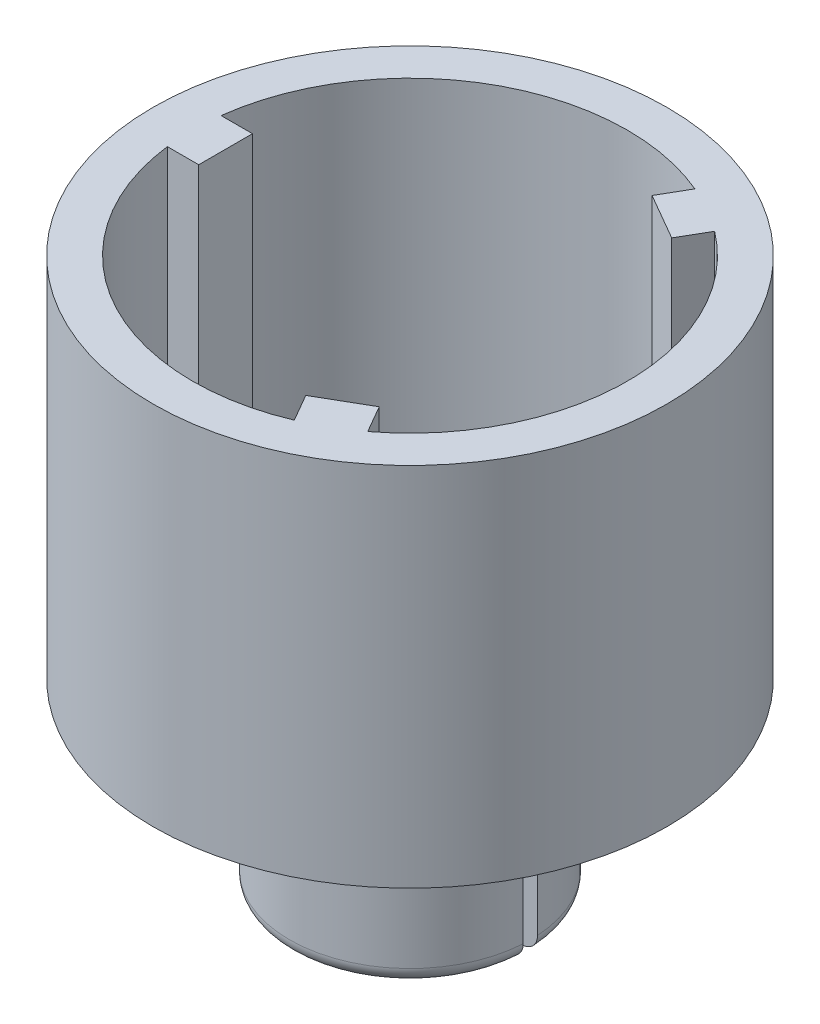
ISO-10303-21;
HEADER;
FILE_DESCRIPTION(('STEP AP214'),'2;1');
FILE_NAME('part.step','',(''),(''),'','','');
FILE_SCHEMA(('AUTOMOTIVE_DESIGN { 1 0 10303 214 1 1 1 1 }'));
ENDSEC;
DATA;
#1=APPLICATION_CONTEXT('core data for automotive mechanical design processes');
#2=APPLICATION_PROTOCOL_DEFINITION('international standard','automotive_design',2000,#1);
#3=PRODUCT_CONTEXT('',#1,'mechanical');
#4=PRODUCT('Part','Part','',(#3));
#5=PRODUCT_RELATED_PRODUCT_CATEGORY('part','',(#4));
#6=PRODUCT_DEFINITION_FORMATION('','',#4);
#7=PRODUCT_DEFINITION_CONTEXT('part definition',#1,'design');
#8=PRODUCT_DEFINITION('design','',#6,#7);
#9=PRODUCT_DEFINITION_SHAPE('','',#8);
#10=(LENGTH_UNIT() NAMED_UNIT(*) SI_UNIT(.MILLI.,.METRE.));
#11=(NAMED_UNIT(*) PLANE_ANGLE_UNIT() SI_UNIT($,.RADIAN.));
#12=(NAMED_UNIT(*) SI_UNIT($,.STERADIAN.) SOLID_ANGLE_UNIT());
#13=UNCERTAINTY_MEASURE_WITH_UNIT(LENGTH_MEASURE(1.E-05),#10,'distance_accuracy_value','');
#14=(GEOMETRIC_REPRESENTATION_CONTEXT(3) GLOBAL_UNCERTAINTY_ASSIGNED_CONTEXT((#13)) GLOBAL_UNIT_ASSIGNED_CONTEXT((#10,
#11,#12)) REPRESENTATION_CONTEXT('',''));
#15=CARTESIAN_POINT('',(0.,0.,0.));
#16=DIRECTION('',(0.,0.,1.));
#17=DIRECTION('',(1.,0.,0.));
#18=AXIS2_PLACEMENT_3D('',#15,#16,#17);
#19=CARTESIAN_POINT('',(0.,6.29999999999999,0.));
#20=DIRECTION('',(0.,1.,0.));
#21=DIRECTION('',(0.,0.,1.));
#22=AXIS2_PLACEMENT_3D('',#19,#20,#21);
#23=CYLINDRICAL_SURFACE('',#22,27.5);
#24=CARTESIAN_POINT('',(0.,46.3,0.));
#25=DIRECTION('',(0.,1.,0.));
#26=DIRECTION('',(0.,0.,1.));
#27=AXIS2_PLACEMENT_3D('',#24,#25,#26);
#28=CIRCLE('',#27,27.5);
#29=CARTESIAN_POINT('',(16.5889907610815,46.3,21.9329748444836));
#30=VERTEX_POINT('',#29);
#31=CARTESIAN_POINT('',(16.5889907610812,46.3,-21.9329748444839));
#32=VERTEX_POINT('',#31);
#33=EDGE_CURVE('E57',#30,#32,#28,.T.);
#34=ORIENTED_EDGE('',*,*,#33,.T.);
#35=DIRECTION('',(0.,1.,0.));
#36=VECTOR('',#35,1.);
#37=CARTESIAN_POINT('',(16.5889907610812,6.29999999999999,-21.9329748444839));
#38=LINE('',#37,#36);
#39=CARTESIAN_POINT('',(16.5889907610812,6.29999999999999,-21.9329748444839));
#40=VERTEX_POINT('',#39);
#41=EDGE_CURVE('E215',#32,#40,#38,.F.);
#42=ORIENTED_EDGE('',*,*,#41,.T.);
#43=CARTESIAN_POINT('',(0.,6.29999999999999,0.));
#44=DIRECTION('',(0.,1.,0.));
#45=DIRECTION('',(0.,0.,1.));
#46=AXIS2_PLACEMENT_3D('',#43,#44,#45);
#47=CIRCLE('',#46,27.5);
#48=CARTESIAN_POINT('',(16.5889907610815,6.29999999999999,21.9329748444836));
#49=VERTEX_POINT('',#48);
#50=EDGE_CURVE('E307',#49,#40,#47,.T.);
#51=ORIENTED_EDGE('',*,*,#50,.F.);
#52=DIRECTION('',(0.,1.,0.));
#53=VECTOR('',#52,1.);
#54=CARTESIAN_POINT('',(16.5889907610815,6.29999999999999,21.9329748444836));
#55=LINE('',#54,#53);
#56=EDGE_CURVE('E234',#49,#30,#55,.T.);
#57=ORIENTED_EDGE('',*,*,#56,.T.);
#58=EDGE_LOOP('',(#34,#42,#51,#57));
#59=FACE_BOUND('',#58,.T.);
#60=ADVANCED_FACE('F33',(#59),#23,.F.);
#61=CARTESIAN_POINT('',(-27.2890087764287,46.3,3.4));
#62=VERTEX_POINT('',#61);
#63=CARTESIAN_POINT('',(10.7000180153474,46.3,25.3329748444837));
#64=VERTEX_POINT('',#63);
#65=EDGE_CURVE('E309',#62,#64,#28,.T.);
#66=ORIENTED_EDGE('',*,*,#65,.T.);
#67=DIRECTION('',(0.,1.,0.));
#68=VECTOR('',#67,1.);
#69=CARTESIAN_POINT('',(10.7000180153474,6.29999999999999,25.3329748444837));
#70=LINE('',#69,#68);
#71=CARTESIAN_POINT('',(10.7000180153474,6.29999999999999,25.3329748444837));
#72=VERTEX_POINT('',#71);
#73=EDGE_CURVE('E236',#64,#72,#70,.F.);
#74=ORIENTED_EDGE('',*,*,#73,.T.);
#75=CARTESIAN_POINT('',(-27.2890087764287,6.29999999999999,3.4));
#76=VERTEX_POINT('',#75);
#77=EDGE_CURVE('E303',#76,#72,#47,.T.);
#78=ORIENTED_EDGE('',*,*,#77,.F.);
#79=DIRECTION('',(0.,1.,0.));
#80=VECTOR('',#79,1.);
#81=CARTESIAN_POINT('',(-27.2890087764287,6.29999999999999,3.4));
#82=LINE('',#81,#80);
#83=EDGE_CURVE('E270',#76,#62,#82,.T.);
#84=ORIENTED_EDGE('',*,*,#83,.T.);
#85=EDGE_LOOP('',(#66,#74,#78,#84));
#86=FACE_BOUND('',#85,.T.);
#87=ADVANCED_FACE('F431',(#86),#23,.F.);
#88=CARTESIAN_POINT('',(33.0968426441505,59.2183375863677,0.903363251346434));
#89=DIRECTION('',(0.,0.,1.));
#90=DIRECTION('',(1.,0.,0.));
#91=AXIS2_PLACEMENT_3D('',#88,#89,#90);
#92=PLANE('',#91);
#93=DIRECTION('',(-1.,0.,0.));
#94=VECTOR('',#93,1.);
#95=CARTESIAN_POINT('',(0.,-23.,0.903363251346434));
#96=LINE('',#95,#94);
#97=CARTESIAN_POINT('',(13.2191692188321,-23.,0.903363251346434));
#98=VERTEX_POINT('',#97);
#99=CARTESIAN_POINT('',(7.44539688909307,-23.,0.903363251346434));
#100=VERTEX_POINT('',#99);
#101=EDGE_CURVE('E326',#98,#100,#96,.T.);
#102=ORIENTED_EDGE('',*,*,#101,.T.);
#103=DIRECTION('',(0.,1.,0.));
#104=VECTOR('',#103,1.);
#105=CARTESIAN_POINT('',(7.44539688909307,-23.1133466704744,0.903363251346434));
#106=LINE('',#105,#104);
#107=CARTESIAN_POINT('',(7.44539688909307,-7.,0.903363251346434));
#108=VERTEX_POINT('',#107);
#109=EDGE_CURVE('E245',#100,#108,#106,.T.);
#110=ORIENTED_EDGE('',*,*,#109,.T.);
#111=DIRECTION('',(1.,0.,0.));
#112=VECTOR('',#111,1.);
#113=CARTESIAN_POINT('',(33.0968426441505,-7.,0.903363251346434));
#114=LINE('',#113,#112);
#115=CARTESIAN_POINT('',(15.2232202518428,-7.,0.903363251346434));
#116=VERTEX_POINT('',#115);
#117=EDGE_CURVE('E275',#108,#116,#114,.T.);
#118=ORIENTED_EDGE('',*,*,#117,.T.);
#119=DIRECTION('',(0.,1.,0.));
#120=VECTOR('',#119,1.);
#121=CARTESIAN_POINT('',(15.2232202518428,-23.,0.903363251346434));
#122=LINE('',#121,#120);
#123=CARTESIAN_POINT('',(15.2232202518428,-21.,0.903363251346434));
#124=VERTEX_POINT('',#123);
#125=EDGE_CURVE('E292',#124,#116,#122,.T.);
#126=ORIENTED_EDGE('',*,*,#125,.F.);
#127=CARTESIAN_POINT('',(15.2232202518428,-21.,0.903363251346434));
#128=CARTESIAN_POINT('',(15.2232199232489,-21.0561948021802,0.903363251346434));
#129=CARTESIAN_POINT('',(15.2208462010748,-21.1123626608613,0.903363251346434));
#130=CARTESIAN_POINT('',(15.211376767415,-21.2242959584954,0.903363251346434));
#131=CARTESIAN_POINT('',(15.2042812970132,-21.2800614178472,0.903363251346434));
#132=CARTESIAN_POINT('',(15.1759810982783,-21.4460523458939,0.903363251346434));
#133=CARTESIAN_POINT('',(15.1477623870815,-21.5551651452531,0.903363251346434));
#134=CARTESIAN_POINT('',(15.0734106566527,-21.7671001409726,0.903363251346434));
#135=CARTESIAN_POINT('',(15.0272693095068,-21.8699193872293,0.903363251346434));
#136=CARTESIAN_POINT('',(14.9183959883233,-22.0663574694,0.903363251346434));
#137=CARTESIAN_POINT('',(14.8556667286063,-22.1599778071192,0.903363251346434));
#138=CARTESIAN_POINT('',(14.7153560416617,-22.3354365581613,0.903363251346434));
#139=CARTESIAN_POINT('',(14.6377642041245,-22.4172666423318,0.903363251346434));
#140=CARTESIAN_POINT('',(14.469946451435,-22.5667823902729,0.903363251346434));
#141=CARTESIAN_POINT('',(14.3797180536156,-22.6344652680558,0.903363251346434));
#142=CARTESIAN_POINT('',(14.1890336936746,-22.7538779272838,0.903363251346434));
#143=CARTESIAN_POINT('',(14.0885588357039,-22.8055774991095,0.903363251346434));
#144=CARTESIAN_POINT('',(13.8803857068313,-22.8913863101094,0.903363251346434));
#145=CARTESIAN_POINT('',(13.7726914572009,-22.925505251361,0.903363251346434));
#146=CARTESIAN_POINT('',(13.5901629405491,-22.9668623444403,0.903363251346434));
#147=CARTESIAN_POINT('',(13.5164605185664,-22.9792819990314,0.903363251346434));
#148=CARTESIAN_POINT('',(13.368238510768,-22.9958498253569,0.903363251346434));
#149=CARTESIAN_POINT('',(13.2937202413688,-23.0000097771421,0.903363251346434));
#150=CARTESIAN_POINT('',(13.2191692188321,-23.,0.903363251346434));
#151=B_SPLINE_CURVE_WITH_KNOTS('',3,(#127,#128,#129,#130,#131,#132,#133,#134,#135,#136,#137,
#138,#139,#140,#141,#142,#143,#144,#145,#146,#147,#148,#149,#150),.UNSPECIFIED.,.F.,.F.,(4,2,2,
2,2,2,2,2,2,2,2,4),(0.,0.168480781633668,0.336952961602159,0.673326346007657,1.00985621666657,
1.34633105416501,1.68304243888204,2.01982006931767,2.35723039660949,2.69445432008634,
2.91824695183647,3.14172017891371),.UNSPECIFIED.);
#152=EDGE_CURVE('E332',#124,#98,#151,.T.);
#153=ORIENTED_EDGE('',*,*,#152,.T.);
#154=EDGE_LOOP('',(#102,#110,#118,#126,#153));
#155=FACE_BOUND('',#154,.T.);
#156=ADVANCED_FACE('F356',(#155),#92,.F.);
#157=CARTESIAN_POINT('',(33.0968426441505,59.2183375863677,-0.903363251346434));
#158=DIRECTION('',(0.,0.,-1.));
#159=DIRECTION('',(-1.,0.,0.));
#160=AXIS2_PLACEMENT_3D('',#157,#158,#159);
#161=PLANE('',#160);
#162=DIRECTION('',(1.,0.,0.));
#163=VECTOR('',#162,1.);
#164=CARTESIAN_POINT('',(0.,-23.,-0.903363251346434));
#165=LINE('',#164,#163);
#166=CARTESIAN_POINT('',(-13.2191692188321,-23.,-0.903363251346434));
#167=VERTEX_POINT('',#166);
#168=CARTESIAN_POINT('',(-7.44539688909307,-23.,-0.903363251346434));
#169=VERTEX_POINT('',#168);
#170=EDGE_CURVE('E322',#167,#169,#165,.T.);
#171=ORIENTED_EDGE('',*,*,#170,.T.);
#172=DIRECTION('',(0.,1.,0.));
#173=VECTOR('',#172,1.);
#174=CARTESIAN_POINT('',(-7.44539688909307,-23.1133466704744,-0.903363251346434));
#175=LINE('',#174,#173);
#176=CARTESIAN_POINT('',(-7.44539688909307,-7.,-0.903363251346434));
#177=VERTEX_POINT('',#176);
#178=EDGE_CURVE('E390',#169,#177,#175,.T.);
#179=ORIENTED_EDGE('',*,*,#178,.T.);
#180=DIRECTION('',(-1.,0.,0.));
#181=VECTOR('',#180,1.);
#182=CARTESIAN_POINT('',(33.0968426441505,-7.,-0.903363251346434));
#183=LINE('',#182,#181);
#184=CARTESIAN_POINT('',(-15.2232202518428,-7.,-0.903363251346434));
#185=VERTEX_POINT('',#184);
#186=EDGE_CURVE('E279',#177,#185,#183,.T.);
#187=ORIENTED_EDGE('',*,*,#186,.T.);
#188=DIRECTION('',(0.,1.,0.));
#189=VECTOR('',#188,1.);
#190=CARTESIAN_POINT('',(-15.2232202518428,-23.,-0.903363251346434));
#191=LINE('',#190,#189);
#192=CARTESIAN_POINT('',(-15.2232202518428,-21.,-0.903363251346434));
#193=VERTEX_POINT('',#192);
#194=EDGE_CURVE('E286',#193,#185,#191,.T.);
#195=ORIENTED_EDGE('',*,*,#194,.F.);
#196=CARTESIAN_POINT('',(-15.2232202518428,-21.,-0.903363251346434));
#197=CARTESIAN_POINT('',(-15.2232199232489,-21.0561948021802,-0.903363251346434));
#198=CARTESIAN_POINT('',(-15.2208462010748,-21.1123626608613,-0.903363251346434));
#199=CARTESIAN_POINT('',(-15.211376767415,-21.2242959584954,-0.903363251346434));
#200=CARTESIAN_POINT('',(-15.2042812970132,-21.2800614178472,-0.903363251346434));
#201=CARTESIAN_POINT('',(-15.1759810982783,-21.4460523458939,-0.903363251346434));
#202=CARTESIAN_POINT('',(-15.1477623870815,-21.5551651452531,-0.903363251346434));
#203=CARTESIAN_POINT('',(-15.0734106566527,-21.7671001409726,-0.903363251346434));
#204=CARTESIAN_POINT('',(-15.0272693095068,-21.8699193872293,-0.903363251346434));
#205=CARTESIAN_POINT('',(-14.9183959883233,-22.0663574694,-0.903363251346434));
#206=CARTESIAN_POINT('',(-14.8556667286063,-22.1599778071192,-0.903363251346434));
#207=CARTESIAN_POINT('',(-14.7153560416617,-22.3354365581613,-0.903363251346434));
#208=CARTESIAN_POINT('',(-14.6377642041245,-22.4172666423318,-0.903363251346434));
#209=CARTESIAN_POINT('',(-14.469946451435,-22.5667823902729,-0.903363251346434));
#210=CARTESIAN_POINT('',(-14.3797180536156,-22.6344652680558,-0.903363251346434));
#211=CARTESIAN_POINT('',(-14.1890336936746,-22.7538779272838,-0.903363251346434));
#212=CARTESIAN_POINT('',(-14.0885588357039,-22.8055774991095,-0.903363251346434));
#213=CARTESIAN_POINT('',(-13.8803857068313,-22.8913863101094,-0.903363251346434));
#214=CARTESIAN_POINT('',(-13.7726914572009,-22.925505251361,-0.903363251346434));
#215=CARTESIAN_POINT('',(-13.5901629405491,-22.9668623444403,-0.903363251346434));
#216=CARTESIAN_POINT('',(-13.5164605185664,-22.9792819990314,-0.903363251346434));
#217=CARTESIAN_POINT('',(-13.368238510768,-22.9958498253569,-0.903363251346434));
#218=CARTESIAN_POINT('',(-13.2937202413688,-23.0000097771421,-0.903363251346434));
#219=CARTESIAN_POINT('',(-13.2191692188321,-23.,-0.903363251346434));
#220=B_SPLINE_CURVE_WITH_KNOTS('',3,(#196,#197,#198,#199,#200,#201,#202,#203,#204,#205,#206,
#207,#208,#209,#210,#211,#212,#213,#214,#215,#216,#217,#218,#219),.UNSPECIFIED.,.F.,.F.,(4,2,2,
2,2,2,2,2,2,2,2,4),(0.,0.168480781633668,0.336952961602159,0.673326346007657,1.00985621666657,
1.34633105416501,1.68304243888204,2.01982006931767,2.35723039660949,2.69445432008634,
2.91824695183647,3.14172017891371),.UNSPECIFIED.);
#221=EDGE_CURVE('E369',#193,#167,#220,.T.);
#222=ORIENTED_EDGE('',*,*,#221,.T.);
#223=EDGE_LOOP('',(#171,#179,#187,#195,#222));
#224=FACE_BOUND('',#223,.T.);
#225=ADVANCED_FACE('F364',(#224),#161,.F.);
#226=CARTESIAN_POINT('',(0.,-23.,0.));
#227=DIRECTION('',(0.,1.,0.));
#228=DIRECTION('',(0.,0.,1.));
#229=AXIS2_PLACEMENT_3D('',#226,#227,#228);
#230=CYLINDRICAL_SURFACE('',#229,15.25);
#231=DIRECTION('',(0.,1.,0.));
#232=VECTOR('',#231,1.);
#233=CARTESIAN_POINT('',(-15.2232202518428,-23.,0.903363251346434));
#234=LINE('',#233,#232);
#235=CARTESIAN_POINT('',(-15.2232202518428,-7.,0.903363251346434));
#236=VERTEX_POINT('',#235);
#237=CARTESIAN_POINT('',(-15.2232202518428,-21.,0.903363251346434));
#238=VERTEX_POINT('',#237);
#239=EDGE_CURVE('E289',#236,#238,#234,.F.);
#240=ORIENTED_EDGE('',*,*,#239,.T.);
#241=CARTESIAN_POINT('',(0.,-21.,0.));
#242=DIRECTION('',(0.,-1.,0.));
#243=DIRECTION('',(0.,0.,-1.));
#244=AXIS2_PLACEMENT_3D('',#241,#242,#243);
#245=CIRCLE('',#244,15.25);
#246=EDGE_CURVE('E502',#238,#124,#245,.F.);
#247=ORIENTED_EDGE('',*,*,#246,.T.);
#248=ORIENTED_EDGE('',*,*,#125,.T.);
#249=CARTESIAN_POINT('',(0.,-7.,0.));
#250=DIRECTION('',(0.,-1.,0.));
#251=DIRECTION('',(0.,0.,-1.));
#252=AXIS2_PLACEMENT_3D('',#249,#250,#251);
#253=CIRCLE('',#252,15.25);
#254=EDGE_CURVE('E299',#116,#236,#253,.T.);
#255=ORIENTED_EDGE('',*,*,#254,.T.);
#256=EDGE_LOOP('',(#240,#247,#248,#255));
#257=FACE_BOUND('',#256,.T.);
#258=ADVANCED_FACE('F484',(#257),#230,.T.);
#259=CARTESIAN_POINT('',(0.,-23.,0.));
#260=DIRECTION('',(0.,-1.,0.));
#261=DIRECTION('',(0.,0.,-1.));
#262=AXIS2_PLACEMENT_3D('',#259,#260,#261);
#263=PLANE('',#262);
#264=CARTESIAN_POINT('',(0.,-23.,0.));
#265=DIRECTION('',(0.,-1.,0.));
#266=DIRECTION('',(0.,0.,-1.));
#267=AXIS2_PLACEMENT_3D('',#264,#265,#266);
#268=CIRCLE('',#267,7.5);
#269=CARTESIAN_POINT('',(-7.44539688909307,-23.,0.903363251346434));
#270=VERTEX_POINT('',#269);
#271=EDGE_CURVE('E249',#100,#270,#268,.T.);
#272=ORIENTED_EDGE('',*,*,#271,.F.);
#273=ORIENTED_EDGE('',*,*,#101,.F.);
#274=CARTESIAN_POINT('',(0.,-23.,0.));
#275=DIRECTION('',(0.,-1.,0.));
#276=DIRECTION('',(0.,0.,-1.));
#277=AXIS2_PLACEMENT_3D('',#274,#275,#276);
#278=CIRCLE('',#277,13.25);
#279=CARTESIAN_POINT('',(-13.2191692188321,-23.,0.903363251346434));
#280=VERTEX_POINT('',#279);
#281=EDGE_CURVE('E329',#98,#280,#278,.T.);
#282=ORIENTED_EDGE('',*,*,#281,.T.);
#283=EDGE_CURVE('E325',#270,#280,#96,.T.);
#284=ORIENTED_EDGE('',*,*,#283,.F.);
#285=EDGE_LOOP('',(#272,#273,#282,#284));
#286=FACE_BOUND('',#285,.T.);
#287=ADVANCED_FACE('F458',(#286),#263,.T.);
#288=CARTESIAN_POINT('',(0.,46.3,0.));
#289=DIRECTION('',(0.,-1.,0.));
#290=DIRECTION('',(0.,0.,-1.));
#291=AXIS2_PLACEMENT_3D('',#288,#289,#290);
#292=CYLINDRICAL_SURFACE('',#291,32.5);
#293=CARTESIAN_POINT('',(0.,46.3,0.));
#294=DIRECTION('',(0.,1.,0.));
#295=DIRECTION('',(0.,0.,1.));
#296=AXIS2_PLACEMENT_3D('',#293,#294,#295);
#297=CIRCLE('',#296,32.5);
#298=CARTESIAN_POINT('',(0.,46.3,32.5));
#299=VERTEX_POINT('',#298);
#300=EDGE_CURVE('E300',#299,#299,#297,.T.);
#301=ORIENTED_EDGE('',*,*,#300,.F.);
#302=EDGE_LOOP('',(#301));
#303=FACE_BOUND('',#302,.T.);
#304=CARTESIAN_POINT('',(0.,0.,0.));
#305=DIRECTION('',(0.,1.,0.));
#306=DIRECTION('',(0.,0.,1.));
#307=AXIS2_PLACEMENT_3D('',#304,#305,#306);
#308=CIRCLE('',#307,32.5);
#309=CARTESIAN_POINT('',(0.,0.,32.5));
#310=VERTEX_POINT('',#309);
#311=EDGE_CURVE('E306',#310,#310,#308,.T.);
#312=ORIENTED_EDGE('',*,*,#311,.T.);
#313=EDGE_LOOP('',(#312));
#314=FACE_BOUND('',#313,.T.);
#315=ADVANCED_FACE('F453',(#303,#314),#292,.T.);
#316=CARTESIAN_POINT('',(0.,46.3,0.));
#317=DIRECTION('',(0.,1.,0.));
#318=DIRECTION('',(0.,0.,1.));
#319=AXIS2_PLACEMENT_3D('',#316,#317,#318);
#320=PLANE('',#319);
#321=ORIENTED_EDGE('',*,*,#300,.T.);
#322=EDGE_LOOP('',(#321));
#323=FACE_BOUND('',#322,.T.);
#324=DIRECTION('',(0.499999999999992,0.,-0.866025403784443));
#325=VECTOR('',#324,1.);
#326=CARTESIAN_POINT('',(19.1053186534148,46.3,-26.2913826025084));
#327=LINE('',#326,#325);
#328=CARTESIAN_POINT('',(14.6053186534148,46.3,-18.4971539684484));
#329=VERTEX_POINT('',#328);
#330=EDGE_CURVE('E203',#329,#32,#327,.T.);
#331=ORIENTED_EDGE('',*,*,#330,.T.);
#332=ORIENTED_EDGE('',*,*,#33,.F.);
#333=DIRECTION('',(-0.500000000000004,0.,-0.866025403784436));
#334=VECTOR('',#333,1.);
#335=CARTESIAN_POINT('',(19.1053186534151,46.3,26.2913826025081));
#336=LINE('',#335,#334);
#337=CARTESIAN_POINT('',(14.6053186534151,46.3,18.4971539684482));
#338=VERTEX_POINT('',#337);
#339=EDGE_CURVE('E217',#30,#338,#336,.T.);
#340=ORIENTED_EDGE('',*,*,#339,.T.);
#341=DIRECTION('',(-0.866025403784436,0.,0.500000000000004));
#342=VECTOR('',#341,1.);
#343=CARTESIAN_POINT('',(14.6053186534151,46.3,18.4971539684482));
#344=LINE('',#343,#342);
#345=CARTESIAN_POINT('',(8.71634590768094,46.3,21.8971539684482));
#346=VERTEX_POINT('',#345);
#347=EDGE_CURVE('E223',#338,#346,#344,.T.);
#348=ORIENTED_EDGE('',*,*,#347,.T.);
#349=DIRECTION('',(0.500000000000004,0.,0.866025403784436));
#350=VECTOR('',#349,1.);
#351=CARTESIAN_POINT('',(13.216345907681,46.3,29.6913826025082));
#352=LINE('',#351,#350);
#353=EDGE_CURVE('E226',#346,#64,#352,.T.);
#354=ORIENTED_EDGE('',*,*,#353,.T.);
#355=ORIENTED_EDGE('',*,*,#65,.F.);
#356=DIRECTION('',(1.,0.,0.));
#357=VECTOR('',#356,1.);
#358=CARTESIAN_POINT('',(-32.3216645610959,46.3,3.4));
#359=LINE('',#358,#357);
#360=CARTESIAN_POINT('',(-23.3216645610959,46.3,3.4));
#361=VERTEX_POINT('',#360);
#362=EDGE_CURVE('E254',#62,#361,#359,.T.);
#363=ORIENTED_EDGE('',*,*,#362,.T.);
#364=DIRECTION('',(0.,0.,-1.));
#365=VECTOR('',#364,1.);
#366=CARTESIAN_POINT('',(-23.3216645610959,46.3,3.4));
#367=LINE('',#366,#365);
#368=CARTESIAN_POINT('',(-23.3216645610959,46.3,-3.4));
#369=VERTEX_POINT('',#368);
#370=EDGE_CURVE('E260',#361,#369,#367,.T.);
#371=ORIENTED_EDGE('',*,*,#370,.T.);
#372=DIRECTION('',(-1.,0.,0.));
#373=VECTOR('',#372,1.);
#374=CARTESIAN_POINT('',(-32.3216645610959,46.3,-3.4));
#375=LINE('',#374,#373);
#376=CARTESIAN_POINT('',(-27.2890087764287,46.3,-3.4));
#377=VERTEX_POINT('',#376);
#378=EDGE_CURVE('E263',#369,#377,#375,.T.);
#379=ORIENTED_EDGE('',*,*,#378,.T.);
#380=CARTESIAN_POINT('',(10.700018015347,46.3,-25.3329748444838));
#381=VERTEX_POINT('',#380);
#382=EDGE_CURVE('E192',#381,#377,#28,.T.);
#383=ORIENTED_EDGE('',*,*,#382,.F.);
#384=DIRECTION('',(-0.499999999999992,0.,0.866025403784443));
#385=VECTOR('',#384,1.);
#386=CARTESIAN_POINT('',(13.2163459076806,46.3,-29.6913826025083));
#387=LINE('',#386,#385);
#388=CARTESIAN_POINT('',(8.71634590768063,46.3,-21.8971539684484));
#389=VERTEX_POINT('',#388);
#390=EDGE_CURVE('E184',#381,#389,#387,.T.);
#391=ORIENTED_EDGE('',*,*,#390,.T.);
#392=DIRECTION('',(0.866025403784443,0.,0.499999999999992));
#393=VECTOR('',#392,1.);
#394=CARTESIAN_POINT('',(8.71634590768063,46.3,-21.8971539684484));
#395=LINE('',#394,#393);
#396=EDGE_CURVE('E189',#389,#329,#395,.T.);
#397=ORIENTED_EDGE('',*,*,#396,.T.);
#398=EDGE_LOOP('',(#331,#332,#340,#348,#354,#355,#363,#371,#379,#383,#391,#397));
#399=FACE_BOUND('',#398,.T.);
#400=ADVANCED_FACE('F187',(#323,#399),#320,.T.);
#401=CARTESIAN_POINT('',(0.,0.,0.));
#402=DIRECTION('',(0.,1.,0.));
#403=DIRECTION('',(0.,0.,1.));
#404=AXIS2_PLACEMENT_3D('',#401,#402,#403);
#405=PLANE('',#404);
#406=CARTESIAN_POINT('',(0.,0.,0.));
#407=DIRECTION('',(0.,1.,0.));
#408=DIRECTION('',(0.,0.,1.));
#409=AXIS2_PLACEMENT_3D('',#406,#407,#408);
#410=CIRCLE('',#409,24.5);
#411=CARTESIAN_POINT('',(0.,0.,24.5));
#412=VERTEX_POINT('',#411);
#413=EDGE_CURVE('E318',#412,#412,#410,.T.);
#414=ORIENTED_EDGE('',*,*,#413,.T.);
#415=EDGE_LOOP('',(#414));
#416=FACE_BOUND('',#415,.T.);
#417=ORIENTED_EDGE('',*,*,#311,.F.);
#418=EDGE_LOOP('',(#417));
#419=FACE_BOUND('',#418,.T.);
#420=ADVANCED_FACE('F442',(#416,#419),#405,.F.);
#421=CARTESIAN_POINT('',(10.700018015347,6.29999999999999,-25.3329748444838));
#422=VERTEX_POINT('',#421);
#423=CARTESIAN_POINT('',(-27.2890087764287,6.29999999999999,-3.4));
#424=VERTEX_POINT('',#423);
#425=EDGE_CURVE('E308',#422,#424,#47,.T.);
#426=ORIENTED_EDGE('',*,*,#425,.F.);
#427=DIRECTION('',(0.,1.,0.));
#428=VECTOR('',#427,1.);
#429=CARTESIAN_POINT('',(10.700018015347,6.29999999999999,-25.3329748444838));
#430=LINE('',#429,#428);
#431=EDGE_CURVE('E49',#422,#381,#430,.T.);
#432=ORIENTED_EDGE('',*,*,#431,.T.);
#433=ORIENTED_EDGE('',*,*,#382,.T.);
#434=DIRECTION('',(0.,1.,0.));
#435=VECTOR('',#434,1.);
#436=CARTESIAN_POINT('',(-27.2890087764287,6.29999999999999,-3.4));
#437=LINE('',#436,#435);
#438=EDGE_CURVE('E272',#377,#424,#437,.F.);
#439=ORIENTED_EDGE('',*,*,#438,.T.);
#440=EDGE_LOOP('',(#426,#432,#433,#439));
#441=FACE_BOUND('',#440,.T.);
#442=ADVANCED_FACE('F416',(#441),#23,.F.);
#443=CARTESIAN_POINT('',(0.,6.29999999999999,0.));
#444=DIRECTION('',(0.,1.,0.));
#445=DIRECTION('',(0.,0.,1.));
#446=AXIS2_PLACEMENT_3D('',#443,#444,#445);
#447=PLANE('',#446);
#448=DIRECTION('',(0.499999999999992,0.,-0.866025403784443));
#449=VECTOR('',#448,1.);
#450=CARTESIAN_POINT('',(2.94448637286711,6.29999999999999,1.69999999999997));
#451=LINE('',#450,#449);
#452=CARTESIAN_POINT('',(14.6053186534148,6.29999999999999,-18.4971539684484));
#453=VERTEX_POINT('',#452);
#454=EDGE_CURVE('E11',#453,#40,#451,.T.);
#455=ORIENTED_EDGE('',*,*,#454,.F.);
#456=DIRECTION('',(-0.866025403784443,0.,-0.499999999999992));
#457=VECTOR('',#456,1.);
#458=CARTESIAN_POINT('',(8.71634590768063,6.29999999999999,-21.8971539684484));
#459=LINE('',#458,#457);
#460=CARTESIAN_POINT('',(8.71634590768063,6.29999999999999,-21.8971539684484));
#461=VERTEX_POINT('',#460);
#462=EDGE_CURVE('E211',#453,#461,#459,.T.);
#463=ORIENTED_EDGE('',*,*,#462,.T.);
#464=DIRECTION('',(0.499999999999992,0.,-0.866025403784443));
#465=VECTOR('',#464,1.);
#466=CARTESIAN_POINT('',(13.2163459076806,6.29999999999999,-29.6913826025083));
#467=LINE('',#466,#465);
#468=EDGE_CURVE('E199',#461,#422,#467,.T.);
#469=ORIENTED_EDGE('',*,*,#468,.T.);
#470=ORIENTED_EDGE('',*,*,#425,.T.);
#471=DIRECTION('',(-1.,0.,0.));
#472=VECTOR('',#471,1.);
#473=CARTESIAN_POINT('',(0.,6.29999999999999,-3.4));
#474=LINE('',#473,#472);
#475=CARTESIAN_POINT('',(-23.3216645610959,6.29999999999999,-3.4));
#476=VERTEX_POINT('',#475);
#477=EDGE_CURVE('E384',#476,#424,#474,.T.);
#478=ORIENTED_EDGE('',*,*,#477,.F.);
#479=DIRECTION('',(0.,0.,1.));
#480=VECTOR('',#479,1.);
#481=CARTESIAN_POINT('',(-23.3216645610959,6.29999999999999,3.4));
#482=LINE('',#481,#480);
#483=CARTESIAN_POINT('',(-23.3216645610959,6.29999999999999,3.4));
#484=VERTEX_POINT('',#483);
#485=EDGE_CURVE('E255',#476,#484,#482,.T.);
#486=ORIENTED_EDGE('',*,*,#485,.T.);
#487=DIRECTION('',(-1.,0.,0.));
#488=VECTOR('',#487,1.);
#489=CARTESIAN_POINT('',(-32.3216645610959,6.29999999999999,3.4));
#490=LINE('',#489,#488);
#491=EDGE_CURVE('E257',#484,#76,#490,.T.);
#492=ORIENTED_EDGE('',*,*,#491,.T.);
#493=ORIENTED_EDGE('',*,*,#77,.T.);
#494=DIRECTION('',(0.500000000000004,0.,0.866025403784436));
#495=VECTOR('',#494,1.);
#496=CARTESIAN_POINT('',(-2.94448637286708,6.29999999999999,1.70000000000001));
#497=LINE('',#496,#495);
#498=CARTESIAN_POINT('',(8.71634590768094,6.29999999999999,21.8971539684482));
#499=VERTEX_POINT('',#498);
#500=EDGE_CURVE('E42',#499,#72,#497,.T.);
#501=ORIENTED_EDGE('',*,*,#500,.F.);
#502=DIRECTION('',(0.866025403784436,0.,-0.500000000000004));
#503=VECTOR('',#502,1.);
#504=CARTESIAN_POINT('',(14.6053186534151,6.29999999999999,18.4971539684482));
#505=LINE('',#504,#503);
#506=CARTESIAN_POINT('',(14.6053186534151,6.29999999999999,18.4971539684482));
#507=VERTEX_POINT('',#506);
#508=EDGE_CURVE('E218',#499,#507,#505,.T.);
#509=ORIENTED_EDGE('',*,*,#508,.T.);
#510=DIRECTION('',(0.500000000000004,0.,0.866025403784436));
#511=VECTOR('',#510,1.);
#512=CARTESIAN_POINT('',(19.1053186534151,6.29999999999999,26.2913826025081));
#513=LINE('',#512,#511);
#514=EDGE_CURVE('E220',#507,#49,#513,.T.);
#515=ORIENTED_EDGE('',*,*,#514,.T.);
#516=ORIENTED_EDGE('',*,*,#50,.T.);
#517=EDGE_LOOP('',(#455,#463,#469,#470,#478,#486,#492,#493,#501,#509,#515,#516));
#518=FACE_BOUND('',#517,.T.);
#519=CARTESIAN_POINT('',(0.,6.29999999999999,0.));
#520=DIRECTION('',(0.,1.,0.));
#521=DIRECTION('',(0.,0.,1.));
#522=AXIS2_PLACEMENT_3D('',#519,#520,#521);
#523=CIRCLE('',#522,7.5);
#524=CARTESIAN_POINT('',(0.,6.29999999999999,7.5));
#525=VERTEX_POINT('',#524);
#526=EDGE_CURVE('E238',#525,#525,#523,.T.);
#527=ORIENTED_EDGE('',*,*,#526,.F.);
#528=EDGE_LOOP('',(#527));
#529=FACE_BOUND('',#528,.T.);
#530=ADVANCED_FACE('F400',(#518,#529),#447,.T.);
#531=CARTESIAN_POINT('',(0.,-7.,0.));
#532=DIRECTION('',(0.,1.,0.));
#533=DIRECTION('',(0.,0.,1.));
#534=AXIS2_PLACEMENT_3D('',#531,#532,#533);
#535=CYLINDRICAL_SURFACE('',#534,19.5);
#536=CARTESIAN_POINT('',(0.,-5.,0.));
#537=DIRECTION('',(0.,1.,0.));
#538=DIRECTION('',(0.,0.,1.));
#539=AXIS2_PLACEMENT_3D('',#536,#537,#538);
#540=CIRCLE('',#539,19.5);
#541=CARTESIAN_POINT('',(0.,-5.,19.5));
#542=VERTEX_POINT('',#541);
#543=EDGE_CURVE('E315',#542,#542,#540,.F.);
#544=ORIENTED_EDGE('',*,*,#543,.T.);
#545=EDGE_LOOP('',(#544));
#546=FACE_BOUND('',#545,.T.);
#547=CARTESIAN_POINT('',(0.,-7.,0.));
#548=DIRECTION('',(0.,-1.,0.));
#549=DIRECTION('',(0.,0.,-1.));
#550=AXIS2_PLACEMENT_3D('',#547,#548,#549);
#551=CIRCLE('',#550,19.5);
#552=CARTESIAN_POINT('',(0.,-7.,-19.5));
#553=VERTEX_POINT('',#552);
#554=EDGE_CURVE('E295',#553,#553,#551,.T.);
#555=ORIENTED_EDGE('',*,*,#554,.F.);
#556=EDGE_LOOP('',(#555));
#557=FACE_BOUND('',#556,.T.);
#558=ADVANCED_FACE('F447',(#546,#557),#535,.T.);
#559=CARTESIAN_POINT('',(0.,-7.,0.));
#560=DIRECTION('',(0.,-1.,0.));
#561=DIRECTION('',(0.,0.,-1.));
#562=AXIS2_PLACEMENT_3D('',#559,#560,#561);
#563=PLANE('',#562);
#564=CARTESIAN_POINT('',(0.,-7.,0.));
#565=DIRECTION('',(0.,-1.,0.));
#566=DIRECTION('',(0.,0.,-1.));
#567=AXIS2_PLACEMENT_3D('',#564,#565,#566);
#568=CIRCLE('',#567,7.5);
#569=CARTESIAN_POINT('',(7.44539688909307,-7.,-0.903363251346434));
#570=VERTEX_POINT('',#569);
#571=EDGE_CURVE('E243',#570,#108,#568,.T.);
#572=ORIENTED_EDGE('',*,*,#571,.F.);
#573=CARTESIAN_POINT('',(15.2232202518428,-7.,-0.903363251346434));
#574=VERTEX_POINT('',#573);
#575=EDGE_CURVE('E280',#574,#570,#183,.T.);
#576=ORIENTED_EDGE('',*,*,#575,.F.);
#577=EDGE_CURVE('E296',#185,#574,#253,.T.);
#578=ORIENTED_EDGE('',*,*,#577,.F.);
#579=ORIENTED_EDGE('',*,*,#186,.F.);
#580=CARTESIAN_POINT('',(-7.44539688909307,-7.,0.903363251346434));
#581=VERTEX_POINT('',#580);
#582=EDGE_CURVE('E246',#581,#177,#568,.T.);
#583=ORIENTED_EDGE('',*,*,#582,.F.);
#584=EDGE_CURVE('E276',#236,#581,#114,.T.);
#585=ORIENTED_EDGE('',*,*,#584,.F.);
#586=ORIENTED_EDGE('',*,*,#254,.F.);
#587=ORIENTED_EDGE('',*,*,#117,.F.);
#588=EDGE_LOOP('',(#572,#576,#578,#579,#583,#585,#586,#587));
#589=FACE_BOUND('',#588,.T.);
#590=ORIENTED_EDGE('',*,*,#554,.T.);
#591=EDGE_LOOP('',(#590));
#592=FACE_BOUND('',#591,.T.);
#593=ADVANCED_FACE('F473',(#589,#592),#563,.T.);
#594=DIRECTION('',(0.,1.,0.));
#595=VECTOR('',#594,1.);
#596=CARTESIAN_POINT('',(15.2232202518428,-23.,-0.903363251346434));
#597=LINE('',#596,#595);
#598=CARTESIAN_POINT('',(15.2232202518428,-21.,-0.903363251346434));
#599=VERTEX_POINT('',#598);
#600=EDGE_CURVE('E283',#574,#599,#597,.F.);
#601=ORIENTED_EDGE('',*,*,#600,.T.);
#602=CARTESIAN_POINT('',(0.,-21.,0.));
#603=DIRECTION('',(0.,-1.,0.));
#604=DIRECTION('',(0.,0.,-1.));
#605=AXIS2_PLACEMENT_3D('',#602,#603,#604);
#606=CIRCLE('',#605,15.25);
#607=EDGE_CURVE('E382',#599,#193,#606,.F.);
#608=ORIENTED_EDGE('',*,*,#607,.T.);
#609=ORIENTED_EDGE('',*,*,#194,.T.);
#610=ORIENTED_EDGE('',*,*,#577,.T.);
#611=EDGE_LOOP('',(#601,#608,#609,#610));
#612=FACE_BOUND('',#611,.T.);
#613=ADVANCED_FACE('F465',(#612),#230,.T.);
#614=CARTESIAN_POINT('',(0.,-23.,0.));
#615=DIRECTION('',(0.,-1.,0.));
#616=DIRECTION('',(0.,0.,-1.));
#617=AXIS2_PLACEMENT_3D('',#614,#615,#616);
#618=CIRCLE('',#617,7.5);
#619=CARTESIAN_POINT('',(7.44539688909307,-23.,-0.903363251346434));
#620=VERTEX_POINT('',#619);
#621=EDGE_CURVE('E241',#169,#620,#618,.T.);
#622=ORIENTED_EDGE('',*,*,#621,.F.);
#623=ORIENTED_EDGE('',*,*,#170,.F.);
#624=CARTESIAN_POINT('',(0.,-23.,0.));
#625=DIRECTION('',(0.,-1.,0.));
#626=DIRECTION('',(0.,0.,-1.));
#627=AXIS2_PLACEMENT_3D('',#624,#625,#626);
#628=CIRCLE('',#627,13.25);
#629=CARTESIAN_POINT('',(13.2191692188321,-23.,-0.903363251346434));
#630=VERTEX_POINT('',#629);
#631=EDGE_CURVE('E499',#167,#630,#628,.T.);
#632=ORIENTED_EDGE('',*,*,#631,.T.);
#633=EDGE_CURVE('E321',#620,#630,#165,.T.);
#634=ORIENTED_EDGE('',*,*,#633,.F.);
#635=EDGE_LOOP('',(#622,#623,#632,#634));
#636=FACE_BOUND('',#635,.T.);
#637=ADVANCED_FACE('F365',(#636),#263,.T.);
#638=CARTESIAN_POINT('',(0.,-5.,0.));
#639=DIRECTION('',(0.,1.,0.));
#640=DIRECTION('',(0.,0.,1.));
#641=AXIS2_PLACEMENT_3D('',#638,#639,#640);
#642=TOROIDAL_SURFACE('',#641,24.5,5.);
#643=ORIENTED_EDGE('',*,*,#413,.F.);
#644=EDGE_LOOP('',(#643));
#645=FACE_BOUND('',#644,.T.);
#646=ORIENTED_EDGE('',*,*,#543,.F.);
#647=EDGE_LOOP('',(#646));
#648=FACE_BOUND('',#647,.T.);
#649=ADVANCED_FACE('F354',(#645,#648),#642,.F.);
#650=ORIENTED_EDGE('',*,*,#584,.T.);
#651=DIRECTION('',(0.,1.,0.));
#652=VECTOR('',#651,1.);
#653=CARTESIAN_POINT('',(-7.44539688909307,-23.1133466704744,0.903363251346434));
#654=LINE('',#653,#652);
#655=EDGE_CURVE('E251',#581,#270,#654,.F.);
#656=ORIENTED_EDGE('',*,*,#655,.T.);
#657=ORIENTED_EDGE('',*,*,#283,.T.);
#658=CARTESIAN_POINT('',(-13.2191692188321,-23.,0.903363251346434));
#659=CARTESIAN_POINT('',(-13.2756424415771,-22.9999995609033,0.903363251346434));
#660=CARTESIAN_POINT('',(-13.3320887054836,-22.9976177069956,0.903363251346434));
#661=CARTESIAN_POINT('',(-13.444578403289,-22.9881142320961,0.903363251346434));
#662=CARTESIAN_POINT('',(-13.5006218535148,-22.9809928043156,0.903363251346434));
#663=CARTESIAN_POINT('',(-13.6674559687125,-22.9525833628222,0.903363251346434));
#664=CARTESIAN_POINT('',(-13.777130720685,-22.924250021228,0.903363251346434));
#665=CARTESIAN_POINT('',(-13.990165743797,-22.8495662000696,0.903363251346434));
#666=CARTESIAN_POINT('',(-14.0935227313194,-22.8032064419995,0.903363251346434));
#667=CARTESIAN_POINT('',(-14.2909681297702,-22.6937771474923,0.903363251346434));
#668=CARTESIAN_POINT('',(-14.3850583874932,-22.6307109498138,0.903363251346434));
#669=CARTESIAN_POINT('',(-14.5611727518909,-22.4897357020745,0.903363251346434));
#670=CARTESIAN_POINT('',(-14.6432117380692,-22.4118452329068,0.903363251346434));
#671=CARTESIAN_POINT('',(-14.7930355008666,-22.2433537734592,0.903363251346434));
#672=CARTESIAN_POINT('',(-14.8608175189015,-22.1527503289859,0.903363251346434));
#673=CARTESIAN_POINT('',(-14.9800524877207,-21.9616010447955,0.903363251346434));
#674=CARTESIAN_POINT('',(-15.0315336292775,-21.8610727685841,0.903363251346434));
#675=CARTESIAN_POINT('',(-15.1168307364638,-21.6528115741693,0.903363251346434));
#676=CARTESIAN_POINT('',(-15.1506575112983,-21.5450831101023,0.903363251346434));
#677=CARTESIAN_POINT('',(-15.1911452567023,-21.3638957315863,0.903363251346434));
#678=CARTESIAN_POINT('',(-15.203166194833,-21.2915894160377,0.903363251346434));
#679=CARTESIAN_POINT('',(-15.2192024915324,-21.1461989766328,0.903363251346434));
#680=CARTESIAN_POINT('',(-15.2232292335094,-21.073116107964,0.903363251346434));
#681=CARTESIAN_POINT('',(-15.2232202518428,-21.,0.903363251346434));
#682=B_SPLINE_CURVE_WITH_KNOTS('',3,(#658,#659,#660,#661,#662,#663,#664,#665,#666,#667,#668,
#669,#670,#671,#672,#673,#674,#675,#676,#677,#678,#679,#680,#681),.UNSPECIFIED.,.F.,.F.,(4,2,2,
2,2,2,2,2,2,2,2,4),(0.,0.169315847013464,0.33862479220124,0.67670859120119,1.01496663858033,
1.35315713649493,1.69092650183992,2.02876116226415,2.3660083385944,2.70304878629595,
2.92253432632545,3.14170710311557),.UNSPECIFIED.);
#683=EDGE_CURVE('E339',#280,#238,#682,.T.);
#684=ORIENTED_EDGE('',*,*,#683,.T.);
#685=ORIENTED_EDGE('',*,*,#239,.F.);
#686=EDGE_LOOP('',(#650,#656,#657,#684,#685));
#687=FACE_BOUND('',#686,.T.);
#688=ADVANCED_FACE('F348',(#687),#92,.F.);
#689=ORIENTED_EDGE('',*,*,#575,.T.);
#690=DIRECTION('',(0.,1.,0.));
#691=VECTOR('',#690,1.);
#692=CARTESIAN_POINT('',(7.44539688909307,-23.1133466704744,-0.903363251346434));
#693=LINE('',#692,#691);
#694=EDGE_CURVE('E387',#570,#620,#693,.F.);
#695=ORIENTED_EDGE('',*,*,#694,.T.);
#696=ORIENTED_EDGE('',*,*,#633,.T.);
#697=CARTESIAN_POINT('',(13.2191692188321,-23.,-0.903363251346434));
#698=CARTESIAN_POINT('',(13.2756424415771,-22.9999995609033,-0.903363251346434));
#699=CARTESIAN_POINT('',(13.3320887054836,-22.9976177069956,-0.903363251346434));
#700=CARTESIAN_POINT('',(13.444578403289,-22.9881142320961,-0.903363251346434));
#701=CARTESIAN_POINT('',(13.5006218535148,-22.9809928043156,-0.903363251346434));
#702=CARTESIAN_POINT('',(13.6674559687125,-22.9525833628222,-0.903363251346434));
#703=CARTESIAN_POINT('',(13.777130720685,-22.924250021228,-0.903363251346434));
#704=CARTESIAN_POINT('',(13.990165743797,-22.8495662000696,-0.903363251346434));
#705=CARTESIAN_POINT('',(14.0935227313194,-22.8032064419995,-0.903363251346434));
#706=CARTESIAN_POINT('',(14.2909681297702,-22.6937771474923,-0.903363251346434));
#707=CARTESIAN_POINT('',(14.3850583874932,-22.6307109498138,-0.903363251346434));
#708=CARTESIAN_POINT('',(14.5611727518909,-22.4897357020745,-0.903363251346434));
#709=CARTESIAN_POINT('',(14.6432117380692,-22.4118452329068,-0.903363251346434));
#710=CARTESIAN_POINT('',(14.7930355008666,-22.2433537734592,-0.903363251346434));
#711=CARTESIAN_POINT('',(14.8608175189015,-22.1527503289859,-0.903363251346434));
#712=CARTESIAN_POINT('',(14.9800524877207,-21.9616010447955,-0.903363251346434));
#713=CARTESIAN_POINT('',(15.0315336292775,-21.8610727685841,-0.903363251346434));
#714=CARTESIAN_POINT('',(15.1168307364638,-21.6528115741693,-0.903363251346434));
#715=CARTESIAN_POINT('',(15.1506575112983,-21.5450831101023,-0.903363251346434));
#716=CARTESIAN_POINT('',(15.1911452567023,-21.3638957315863,-0.903363251346434));
#717=CARTESIAN_POINT('',(15.203166194833,-21.2915894160377,-0.903363251346434));
#718=CARTESIAN_POINT('',(15.2192024915324,-21.1461989766328,-0.903363251346434));
#719=CARTESIAN_POINT('',(15.2232292335094,-21.073116107964,-0.903363251346434));
#720=CARTESIAN_POINT('',(15.2232202518428,-21.,-0.903363251346434));
#721=B_SPLINE_CURVE_WITH_KNOTS('',3,(#697,#698,#699,#700,#701,#702,#703,#704,#705,#706,#707,
#708,#709,#710,#711,#712,#713,#714,#715,#716,#717,#718,#719,#720),.UNSPECIFIED.,.F.,.F.,(4,2,2,
2,2,2,2,2,2,2,2,4),(0.,0.169315847013464,0.33862479220124,0.67670859120119,1.01496663858033,
1.35315713649493,1.69092650183992,2.02876116226415,2.3660083385944,2.70304878629595,
2.92253432632545,3.14170710311557),.UNSPECIFIED.);
#722=EDGE_CURVE('E376',#630,#599,#721,.T.);
#723=ORIENTED_EDGE('',*,*,#722,.T.);
#724=ORIENTED_EDGE('',*,*,#600,.F.);
#725=EDGE_LOOP('',(#689,#695,#696,#723,#724));
#726=FACE_BOUND('',#725,.T.);
#727=ADVANCED_FACE('F353',(#726),#161,.F.);
#728=CARTESIAN_POINT('',(0.,-21.,0.));
#729=DIRECTION('',(0.,-1.,0.));
#730=DIRECTION('',(0.,0.,-1.));
#731=AXIS2_PLACEMENT_3D('',#728,#729,#730);
#732=TOROIDAL_SURFACE('',#731,13.25,2.);
#733=ORIENTED_EDGE('',*,*,#152,.F.);
#734=ORIENTED_EDGE('',*,*,#246,.F.);
#735=ORIENTED_EDGE('',*,*,#683,.F.);
#736=ORIENTED_EDGE('',*,*,#281,.F.);
#737=EDGE_LOOP('',(#733,#734,#735,#736));
#738=FACE_BOUND('',#737,.T.);
#739=ADVANCED_FACE('F345',(#738),#732,.T.);
#740=CARTESIAN_POINT('',(0.,-21.,0.));
#741=DIRECTION('',(0.,-1.,0.));
#742=DIRECTION('',(0.,0.,-1.));
#743=AXIS2_PLACEMENT_3D('',#740,#741,#742);
#744=TOROIDAL_SURFACE('',#743,13.25,2.);
#745=ORIENTED_EDGE('',*,*,#221,.F.);
#746=ORIENTED_EDGE('',*,*,#607,.F.);
#747=ORIENTED_EDGE('',*,*,#722,.F.);
#748=ORIENTED_EDGE('',*,*,#631,.F.);
#749=EDGE_LOOP('',(#745,#746,#747,#748));
#750=FACE_BOUND('',#749,.T.);
#751=ADVANCED_FACE('F35',(#750),#744,.T.);
#752=CARTESIAN_POINT('',(-32.3216645610959,-4.98007092176287,-3.4));
#753=DIRECTION('',(0.,0.,-1.));
#754=DIRECTION('',(-1.,0.,0.));
#755=AXIS2_PLACEMENT_3D('',#752,#753,#754);
#756=PLANE('',#755);
#757=ORIENTED_EDGE('',*,*,#438,.F.);
#758=ORIENTED_EDGE('',*,*,#378,.F.);
#759=DIRECTION('',(0.,1.,0.));
#760=VECTOR('',#759,1.);
#761=CARTESIAN_POINT('',(-23.3216645610959,-4.98007092176287,-3.4));
#762=LINE('',#761,#760);
#763=EDGE_CURVE('E258',#476,#369,#762,.T.);
#764=ORIENTED_EDGE('',*,*,#763,.F.);
#765=ORIENTED_EDGE('',*,*,#477,.T.);
#766=EDGE_LOOP('',(#757,#758,#764,#765));
#767=FACE_BOUND('',#766,.T.);
#768=ADVANCED_FACE('F420',(#767),#756,.T.);
#769=CARTESIAN_POINT('',(-32.3216645610959,-4.98007092176287,3.4));
#770=DIRECTION('',(0.,0.,1.));
#771=DIRECTION('',(1.,0.,0.));
#772=AXIS2_PLACEMENT_3D('',#769,#770,#771);
#773=PLANE('',#772);
#774=ORIENTED_EDGE('',*,*,#83,.F.);
#775=ORIENTED_EDGE('',*,*,#491,.F.);
#776=DIRECTION('',(0.,1.,0.));
#777=VECTOR('',#776,1.);
#778=CARTESIAN_POINT('',(-23.3216645610959,-4.98007092176287,3.4));
#779=LINE('',#778,#777);
#780=EDGE_CURVE('E265',#484,#361,#779,.T.);
#781=ORIENTED_EDGE('',*,*,#780,.T.);
#782=ORIENTED_EDGE('',*,*,#362,.F.);
#783=EDGE_LOOP('',(#774,#775,#781,#782));
#784=FACE_BOUND('',#783,.T.);
#785=ADVANCED_FACE('F357',(#784),#773,.T.);
#786=CARTESIAN_POINT('',(-23.3216645610959,-4.98007092176287,3.4));
#787=DIRECTION('',(1.,0.,0.));
#788=DIRECTION('',(0.,0.,-1.));
#789=AXIS2_PLACEMENT_3D('',#786,#787,#788);
#790=PLANE('',#789);
#791=ORIENTED_EDGE('',*,*,#485,.F.);
#792=ORIENTED_EDGE('',*,*,#763,.T.);
#793=ORIENTED_EDGE('',*,*,#370,.F.);
#794=ORIENTED_EDGE('',*,*,#780,.F.);
#795=EDGE_LOOP('',(#791,#792,#793,#794));
#796=FACE_BOUND('',#795,.T.);
#797=ADVANCED_FACE('F423',(#796),#790,.T.);
#798=CARTESIAN_POINT('',(0.,-23.1133466704744,0.));
#799=DIRECTION('',(0.,1.,0.));
#800=DIRECTION('',(0.,0.,1.));
#801=AXIS2_PLACEMENT_3D('',#798,#799,#800);
#802=CYLINDRICAL_SURFACE('',#801,7.5);
#803=ORIENTED_EDGE('',*,*,#526,.T.);
#804=EDGE_LOOP('',(#803));
#805=FACE_BOUND('',#804,.T.);
#806=ORIENTED_EDGE('',*,*,#582,.T.);
#807=ORIENTED_EDGE('',*,*,#178,.F.);
#808=ORIENTED_EDGE('',*,*,#621,.T.);
#809=ORIENTED_EDGE('',*,*,#694,.F.);
#810=ORIENTED_EDGE('',*,*,#571,.T.);
#811=ORIENTED_EDGE('',*,*,#109,.F.);
#812=ORIENTED_EDGE('',*,*,#271,.T.);
#813=ORIENTED_EDGE('',*,*,#655,.F.);
#814=EDGE_LOOP('',(#806,#807,#808,#809,#810,#811,#812,#813));
#815=FACE_BOUND('',#814,.T.);
#816=ADVANCED_FACE('F516',(#805,#815),#802,.F.);
#817=CARTESIAN_POINT('',(13.216345907681,-8.97224637776697,29.6913826025082));
#818=DIRECTION('',(-0.866025403784436,0.,0.500000000000004));
#819=DIRECTION('',(0.500000000000004,0.,0.866025403784436));
#820=AXIS2_PLACEMENT_3D('',#817,#818,#819);
#821=PLANE('',#820);
#822=ORIENTED_EDGE('',*,*,#73,.F.);
#823=ORIENTED_EDGE('',*,*,#353,.F.);
#824=DIRECTION('',(0.,1.,0.));
#825=VECTOR('',#824,1.);
#826=CARTESIAN_POINT('',(8.71634590768094,-8.97224637776697,21.8971539684482));
#827=LINE('',#826,#825);
#828=EDGE_CURVE('E221',#499,#346,#827,.T.);
#829=ORIENTED_EDGE('',*,*,#828,.F.);
#830=ORIENTED_EDGE('',*,*,#500,.T.);
#831=EDGE_LOOP('',(#822,#823,#829,#830));
#832=FACE_BOUND('',#831,.T.);
#833=ADVANCED_FACE('F396',(#832),#821,.T.);
#834=CARTESIAN_POINT('',(19.1053186534151,-8.97224637776697,26.2913826025081));
#835=DIRECTION('',(0.866025403784436,0.,-0.500000000000004));
#836=DIRECTION('',(-0.500000000000004,0.,-0.866025403784436));
#837=AXIS2_PLACEMENT_3D('',#834,#835,#836);
#838=PLANE('',#837);
#839=ORIENTED_EDGE('',*,*,#56,.F.);
#840=ORIENTED_EDGE('',*,*,#514,.F.);
#841=DIRECTION('',(0.,1.,0.));
#842=VECTOR('',#841,1.);
#843=CARTESIAN_POINT('',(14.6053186534151,-8.97224637776697,18.4971539684482));
#844=LINE('',#843,#842);
#845=EDGE_CURVE('E229',#507,#338,#844,.T.);
#846=ORIENTED_EDGE('',*,*,#845,.T.);
#847=ORIENTED_EDGE('',*,*,#339,.F.);
#848=EDGE_LOOP('',(#839,#840,#846,#847));
#849=FACE_BOUND('',#848,.T.);
#850=ADVANCED_FACE('F411',(#849),#838,.T.);
#851=CARTESIAN_POINT('',(14.6053186534151,-8.97224637776697,18.4971539684482));
#852=DIRECTION('',(-0.500000000000004,0.,-0.866025403784436));
#853=DIRECTION('',(-0.866025403784436,0.,0.500000000000004));
#854=AXIS2_PLACEMENT_3D('',#851,#852,#853);
#855=PLANE('',#854);
#856=ORIENTED_EDGE('',*,*,#508,.F.);
#857=ORIENTED_EDGE('',*,*,#828,.T.);
#858=ORIENTED_EDGE('',*,*,#347,.F.);
#859=ORIENTED_EDGE('',*,*,#845,.F.);
#860=EDGE_LOOP('',(#856,#857,#858,#859));
#861=FACE_BOUND('',#860,.T.);
#862=ADVANCED_FACE('F405',(#861),#855,.T.);
#863=CARTESIAN_POINT('',(19.1053186534148,-8.9722463777669,-26.2913826025084));
#864=DIRECTION('',(0.866025403784443,0.,0.499999999999992));
#865=DIRECTION('',(0.499999999999992,0.,-0.866025403784443));
#866=AXIS2_PLACEMENT_3D('',#863,#864,#865);
#867=PLANE('',#866);
#868=ORIENTED_EDGE('',*,*,#41,.F.);
#869=ORIENTED_EDGE('',*,*,#330,.F.);
#870=DIRECTION('',(0.,1.,0.));
#871=VECTOR('',#870,1.);
#872=CARTESIAN_POINT('',(14.6053186534148,-8.9722463777669,-18.4971539684484));
#873=LINE('',#872,#871);
#874=EDGE_CURVE('E202',#453,#329,#873,.T.);
#875=ORIENTED_EDGE('',*,*,#874,.F.);
#876=ORIENTED_EDGE('',*,*,#454,.T.);
#877=EDGE_LOOP('',(#868,#869,#875,#876));
#878=FACE_BOUND('',#877,.T.);
#879=ADVANCED_FACE('F576',(#878),#867,.T.);
#880=CARTESIAN_POINT('',(13.2163459076806,-8.9722463777669,-29.6913826025083));
#881=DIRECTION('',(-0.866025403784443,0.,-0.499999999999992));
#882=DIRECTION('',(-0.499999999999992,0.,0.866025403784443));
#883=AXIS2_PLACEMENT_3D('',#880,#881,#882);
#884=PLANE('',#883);
#885=ORIENTED_EDGE('',*,*,#431,.F.);
#886=ORIENTED_EDGE('',*,*,#468,.F.);
#887=DIRECTION('',(0.,1.,0.));
#888=VECTOR('',#887,1.);
#889=CARTESIAN_POINT('',(8.71634590768063,-8.9722463777669,-21.8971539684484));
#890=LINE('',#889,#888);
#891=EDGE_CURVE('E197',#461,#389,#890,.T.);
#892=ORIENTED_EDGE('',*,*,#891,.T.);
#893=ORIENTED_EDGE('',*,*,#390,.F.);
#894=EDGE_LOOP('',(#885,#886,#892,#893));
#895=FACE_BOUND('',#894,.T.);
#896=ADVANCED_FACE('F198',(#895),#884,.T.);
#897=CARTESIAN_POINT('',(8.71634590768063,-8.9722463777669,-21.8971539684484));
#898=DIRECTION('',(-0.499999999999992,0.,0.866025403784443));
#899=DIRECTION('',(0.866025403784443,0.,0.499999999999992));
#900=AXIS2_PLACEMENT_3D('',#897,#898,#899);
#901=PLANE('',#900);
#902=ORIENTED_EDGE('',*,*,#462,.F.);
#903=ORIENTED_EDGE('',*,*,#874,.T.);
#904=ORIENTED_EDGE('',*,*,#396,.F.);
#905=ORIENTED_EDGE('',*,*,#891,.F.);
#906=EDGE_LOOP('',(#902,#903,#904,#905));
#907=FACE_BOUND('',#906,.T.);
#908=ADVANCED_FACE('F205',(#907),#901,.T.);
#909=CLOSED_SHELL('',(#60,#87,#156,#225,#258,#287,#315,#400,#420,#442,#530,#558,#593,#613,#637,
#649,#688,#727,#739,#751,#768,#785,#797,#816,#833,#850,#862,#879,#896,#908));
#910=MANIFOLD_SOLID_BREP('B2',#909);
#911=ADVANCED_BREP_SHAPE_REPRESENTATION('',(#18,#910),#14);
#912=SHAPE_DEFINITION_REPRESENTATION(#9,#911);
ENDSEC;
END-ISO-10303-21;
